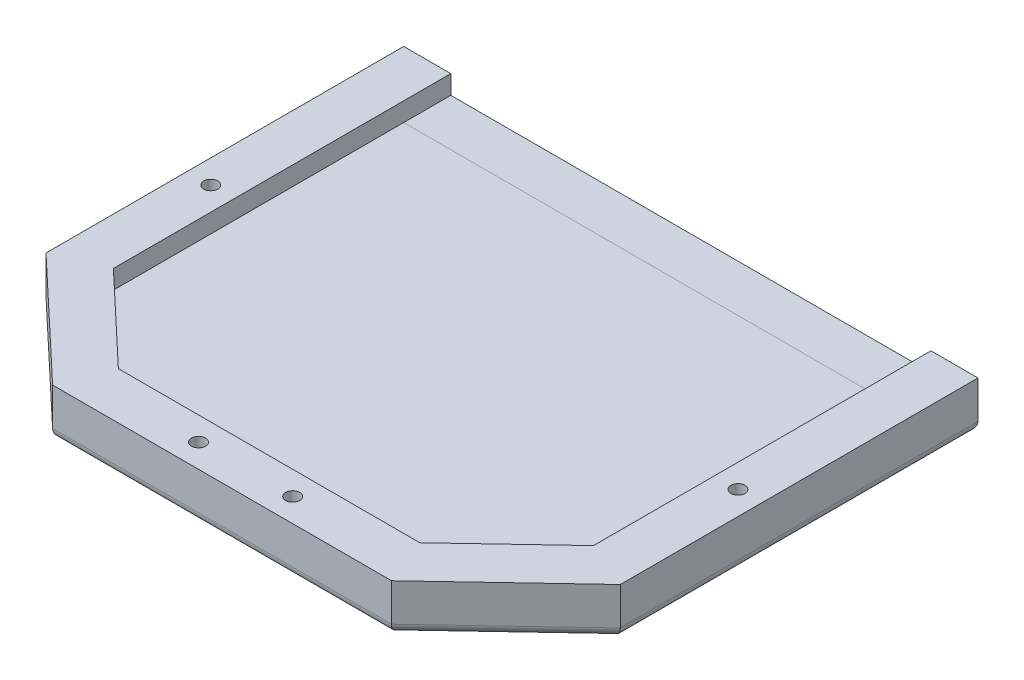
ISO-10303-21;
HEADER;
FILE_DESCRIPTION(('STEP AP214'),'2;1');
FILE_NAME('part.step','',(''),(''),'','','');
FILE_SCHEMA(('AUTOMOTIVE_DESIGN { 1 0 10303 214 1 1 1 1 }'));
ENDSEC;
DATA;
#1=APPLICATION_CONTEXT('core data for automotive mechanical design processes');
#2=APPLICATION_PROTOCOL_DEFINITION('international standard','automotive_design',2000,#1);
#3=PRODUCT_CONTEXT('',#1,'mechanical');
#4=PRODUCT('Part','Part','',(#3));
#5=PRODUCT_RELATED_PRODUCT_CATEGORY('part','',(#4));
#6=PRODUCT_DEFINITION_FORMATION('','',#4);
#7=PRODUCT_DEFINITION_CONTEXT('part definition',#1,'design');
#8=PRODUCT_DEFINITION('design','',#6,#7);
#9=PRODUCT_DEFINITION_SHAPE('','',#8);
#10=(LENGTH_UNIT() NAMED_UNIT(*) SI_UNIT(.MILLI.,.METRE.));
#11=(NAMED_UNIT(*) PLANE_ANGLE_UNIT() SI_UNIT($,.RADIAN.));
#12=(NAMED_UNIT(*) SI_UNIT($,.STERADIAN.) SOLID_ANGLE_UNIT());
#13=UNCERTAINTY_MEASURE_WITH_UNIT(LENGTH_MEASURE(1.E-05),#10,'distance_accuracy_value','');
#14=(GEOMETRIC_REPRESENTATION_CONTEXT(3) GLOBAL_UNCERTAINTY_ASSIGNED_CONTEXT((#13)) GLOBAL_UNIT_ASSIGNED_CONTEXT((#10,
#11,#12)) REPRESENTATION_CONTEXT('',''));
#15=CARTESIAN_POINT('',(0.,0.,0.));
#16=DIRECTION('',(0.,0.,1.));
#17=DIRECTION('',(1.,0.,0.));
#18=AXIS2_PLACEMENT_3D('',#15,#16,#17);
#19=CARTESIAN_POINT('',(-24.7421052631579,3.,43.1447368421053));
#20=DIRECTION('',(1.,0.,0.));
#21=DIRECTION('',(0.,0.,-1.));
#22=AXIS2_PLACEMENT_3D('',#19,#20,#21);
#23=PLANE('',#22);
#24=DIRECTION('',(0.,-1.,0.));
#25=VECTOR('',#24,1.);
#26=CARTESIAN_POINT('',(-24.7421052631579,3.,43.1447368421053));
#27=LINE('',#26,#25);
#28=CARTESIAN_POINT('',(-24.7421052631579,5.,43.1447368421053));
#29=VERTEX_POINT('',#28);
#30=CARTESIAN_POINT('',(-24.7421052631579,1.,43.1447368421053));
#31=VERTEX_POINT('',#30);
#32=EDGE_CURVE('E352',#29,#31,#27,.T.);
#33=ORIENTED_EDGE('',*,*,#32,.T.);
#34=DIRECTION('',(0.,0.,1.));
#35=VECTOR('',#34,1.);
#36=CARTESIAN_POINT('',(-24.7421052631579,1.,81.1447368421053));
#37=LINE('',#36,#35);
#38=CARTESIAN_POINT('',(-24.7421052631579,1.,81.1447368421053));
#39=VERTEX_POINT('',#38);
#40=EDGE_CURVE('E457',#31,#39,#37,.T.);
#41=ORIENTED_EDGE('',*,*,#40,.T.);
#42=DIRECTION('',(0.,-1.,0.));
#43=VECTOR('',#42,1.);
#44=CARTESIAN_POINT('',(-24.7421052631579,3.,81.1447368421053));
#45=LINE('',#44,#43);
#46=CARTESIAN_POINT('',(-24.7421052631579,5.,81.1447368421053));
#47=VERTEX_POINT('',#46);
#48=EDGE_CURVE('E369',#47,#39,#45,.T.);
#49=ORIENTED_EDGE('',*,*,#48,.F.);
#50=DIRECTION('',(0.,0.,1.));
#51=VECTOR('',#50,1.);
#52=CARTESIAN_POINT('',(-24.7421052631579,5.,48.1447368421053));
#53=LINE('',#52,#51);
#54=EDGE_CURVE('E328',#29,#47,#53,.T.);
#55=ORIENTED_EDGE('',*,*,#54,.F.);
#56=EDGE_LOOP('',(#33,#41,#49,#55));
#57=FACE_BOUND('',#56,.T.);
#58=ADVANCED_FACE('F74',(#57),#23,.F.);
#59=CARTESIAN_POINT('',(-24.7421052631579,3.,81.1447368421053));
#60=DIRECTION('',(0.686452693255578,0.,-0.727174463194468));
#61=DIRECTION('',(-0.727174463194468,0.,-0.686452693255578));
#62=AXIS2_PLACEMENT_3D('',#59,#60,#61);
#63=PLANE('',#62);
#64=ORIENTED_EDGE('',*,*,#48,.T.);
#65=DIRECTION('',(0.727174463194468,0.,0.686452693255578));
#66=VECTOR('',#65,1.);
#67=CARTESIAN_POINT('',(-12.2421052631579,1.,92.9447368421053));
#68=LINE('',#67,#66);
#69=CARTESIAN_POINT('',(-12.2421052631579,1.,92.9447368421053));
#70=VERTEX_POINT('',#69);
#71=EDGE_CURVE('E373',#39,#70,#68,.T.);
#72=ORIENTED_EDGE('',*,*,#71,.T.);
#73=DIRECTION('',(0.,-1.,0.));
#74=VECTOR('',#73,1.);
#75=CARTESIAN_POINT('',(-12.2421052631579,3.,92.9447368421053));
#76=LINE('',#75,#74);
#77=CARTESIAN_POINT('',(-12.2421052631579,5.,92.9447368421053));
#78=VERTEX_POINT('',#77);
#79=EDGE_CURVE('E365',#78,#70,#76,.T.);
#80=ORIENTED_EDGE('',*,*,#79,.F.);
#81=DIRECTION('',(0.727174463194468,0.,0.686452693255579));
#82=VECTOR('',#81,1.);
#83=CARTESIAN_POINT('',(-23.1743687294358,5.,82.6246801299389));
#84=LINE('',#83,#82);
#85=EDGE_CURVE('E332',#47,#78,#84,.T.);
#86=ORIENTED_EDGE('',*,*,#85,.F.);
#87=EDGE_LOOP('',(#64,#72,#80,#86));
#88=FACE_BOUND('',#87,.T.);
#89=ADVANCED_FACE('F618',(#88),#63,.F.);
#90=CARTESIAN_POINT('',(23.7578947368421,3.,92.9447368421053));
#91=DIRECTION('',(0.,0.,-1.));
#92=DIRECTION('',(-1.,0.,0.));
#93=AXIS2_PLACEMENT_3D('',#90,#91,#92);
#94=PLANE('',#93);
#95=ORIENTED_EDGE('',*,*,#79,.T.);
#96=DIRECTION('',(1.,0.,0.));
#97=VECTOR('',#96,1.);
#98=CARTESIAN_POINT('',(23.7578947368421,1.,92.9447368421053));
#99=LINE('',#98,#97);
#100=CARTESIAN_POINT('',(23.7578947368421,1.,92.9447368421053));
#101=VERTEX_POINT('',#100);
#102=EDGE_CURVE('E447',#70,#101,#99,.T.);
#103=ORIENTED_EDGE('',*,*,#102,.T.);
#104=DIRECTION('',(0.,-1.,0.));
#105=VECTOR('',#104,1.);
#106=CARTESIAN_POINT('',(23.7578947368421,3.,92.9447368421053));
#107=LINE('',#106,#105);
#108=CARTESIAN_POINT('',(23.7578947368421,5.,92.9447368421053));
#109=VERTEX_POINT('',#108);
#110=EDGE_CURVE('E361',#109,#101,#107,.T.);
#111=ORIENTED_EDGE('',*,*,#110,.F.);
#112=DIRECTION('',(1.,0.,0.));
#113=VECTOR('',#112,1.);
#114=CARTESIAN_POINT('',(-10.2548923096212,5.,92.9447368421053));
#115=LINE('',#114,#113);
#116=EDGE_CURVE('E336',#78,#109,#115,.T.);
#117=ORIENTED_EDGE('',*,*,#116,.F.);
#118=EDGE_LOOP('',(#95,#103,#111,#117));
#119=FACE_BOUND('',#118,.T.);
#120=ADVANCED_FACE('F621',(#119),#94,.F.);
#121=CARTESIAN_POINT('',(36.2578947368421,3.,81.1447368421053));
#122=DIRECTION('',(-0.686452693255578,0.,-0.727174463194468));
#123=DIRECTION('',(-0.727174463194468,0.,0.686452693255578));
#124=AXIS2_PLACEMENT_3D('',#121,#122,#123);
#125=PLANE('',#124);
#126=ORIENTED_EDGE('',*,*,#110,.T.);
#127=DIRECTION('',(0.727174463194468,0.,-0.686452693255578));
#128=VECTOR('',#127,1.);
#129=CARTESIAN_POINT('',(36.2578947368421,1.,81.1447368421053));
#130=LINE('',#129,#128);
#131=CARTESIAN_POINT('',(36.2578947368421,1.,81.1447368421053));
#132=VERTEX_POINT('',#131);
#133=EDGE_CURVE('E450',#101,#132,#130,.T.);
#134=ORIENTED_EDGE('',*,*,#133,.T.);
#135=DIRECTION('',(0.,-1.,0.));
#136=VECTOR('',#135,1.);
#137=CARTESIAN_POINT('',(36.2578947368421,3.,81.1447368421053));
#138=LINE('',#137,#136);
#139=CARTESIAN_POINT('',(36.2578947368421,5.,81.1447368421053));
#140=VERTEX_POINT('',#139);
#141=EDGE_CURVE('E358',#140,#132,#138,.T.);
#142=ORIENTED_EDGE('',*,*,#141,.F.);
#143=DIRECTION('',(0.727174463194468,0.,-0.686452693255578));
#144=VECTOR('',#143,1.);
#145=CARTESIAN_POINT('',(34.69015820312,5.,82.6246801299389));
#146=LINE('',#145,#144);
#147=EDGE_CURVE('E340',#109,#140,#146,.T.);
#148=ORIENTED_EDGE('',*,*,#147,.F.);
#149=EDGE_LOOP('',(#126,#134,#142,#148));
#150=FACE_BOUND('',#149,.T.);
#151=ADVANCED_FACE('F573',(#150),#125,.F.);
#152=CARTESIAN_POINT('',(36.2578947368421,3.,43.1447368421053));
#153=DIRECTION('',(-1.,0.,0.));
#154=DIRECTION('',(0.,0.,1.));
#155=AXIS2_PLACEMENT_3D('',#152,#153,#154);
#156=PLANE('',#155);
#157=ORIENTED_EDGE('',*,*,#141,.T.);
#158=DIRECTION('',(0.,0.,-1.));
#159=VECTOR('',#158,1.);
#160=CARTESIAN_POINT('',(36.2578947368421,1.,43.1447368421053));
#161=LINE('',#160,#159);
#162=CARTESIAN_POINT('',(36.2578947368421,1.,43.1447368421053));
#163=VERTEX_POINT('',#162);
#164=EDGE_CURVE('E105',#132,#163,#161,.T.);
#165=ORIENTED_EDGE('',*,*,#164,.T.);
#166=DIRECTION('',(0.,-1.,0.));
#167=VECTOR('',#166,1.);
#168=CARTESIAN_POINT('',(36.2578947368421,3.,43.1447368421053));
#169=LINE('',#168,#167);
#170=CARTESIAN_POINT('',(36.2578947368421,5.,43.1447368421053));
#171=VERTEX_POINT('',#170);
#172=EDGE_CURVE('E355',#171,#163,#169,.T.);
#173=ORIENTED_EDGE('',*,*,#172,.F.);
#174=DIRECTION('',(0.,0.,-1.));
#175=VECTOR('',#174,1.);
#176=CARTESIAN_POINT('',(36.2578947368421,5.,48.1447368421053));
#177=LINE('',#176,#175);
#178=EDGE_CURVE('E344',#140,#171,#177,.T.);
#179=ORIENTED_EDGE('',*,*,#178,.F.);
#180=EDGE_LOOP('',(#157,#165,#173,#179));
#181=FACE_BOUND('',#180,.T.);
#182=ADVANCED_FACE('F576',(#181),#156,.F.);
#183=CARTESIAN_POINT('',(-24.7421052631579,3.,43.1447368421053));
#184=DIRECTION('',(0.,0.,1.));
#185=DIRECTION('',(1.,0.,0.));
#186=AXIS2_PLACEMENT_3D('',#183,#184,#185);
#187=PLANE('',#186);
#188=DIRECTION('',(-1.,0.,0.));
#189=VECTOR('',#188,1.);
#190=CARTESIAN_POINT('',(-19.7421052631579,5.,43.1447368421053));
#191=LINE('',#190,#189);
#192=CARTESIAN_POINT('',(-19.7421052631579,5.,43.1447368421053));
#193=VERTEX_POINT('',#192);
#194=EDGE_CURVE('E263',#193,#29,#191,.T.);
#195=ORIENTED_EDGE('',*,*,#194,.F.);
#196=DIRECTION('',(0.,-1.,0.));
#197=VECTOR('',#196,1.);
#198=CARTESIAN_POINT('',(-19.7421052631579,5.,43.1447368421053));
#199=LINE('',#198,#197);
#200=CARTESIAN_POINT('',(-19.7421052631579,2.9999,43.1447368421053));
#201=VERTEX_POINT('',#200);
#202=EDGE_CURVE('E244',#193,#201,#199,.T.);
#203=ORIENTED_EDGE('',*,*,#202,.T.);
#204=DIRECTION('',(1.,0.,0.));
#205=VECTOR('',#204,1.);
#206=CARTESIAN_POINT('',(0.,2.9999,43.1447368421053));
#207=LINE('',#206,#205);
#208=CARTESIAN_POINT('',(31.2578947368421,2.9999,43.1447368421053));
#209=VERTEX_POINT('',#208);
#210=EDGE_CURVE('E252',#201,#209,#207,.T.);
#211=ORIENTED_EDGE('',*,*,#210,.T.);
#212=DIRECTION('',(0.,-1.,0.));
#213=VECTOR('',#212,1.);
#214=CARTESIAN_POINT('',(31.2578947368421,5.,43.1447368421053));
#215=LINE('',#214,#213);
#216=CARTESIAN_POINT('',(31.2578947368421,5.,43.1447368421053));
#217=VERTEX_POINT('',#216);
#218=EDGE_CURVE('E582',#217,#209,#215,.T.);
#219=ORIENTED_EDGE('',*,*,#218,.F.);
#220=EDGE_CURVE('E348',#171,#217,#191,.T.);
#221=ORIENTED_EDGE('',*,*,#220,.F.);
#222=ORIENTED_EDGE('',*,*,#172,.T.);
#223=DIRECTION('',(-1.,0.,0.));
#224=VECTOR('',#223,1.);
#225=CARTESIAN_POINT('',(-24.7421052631579,1.,43.1447368421053));
#226=LINE('',#225,#224);
#227=EDGE_CURVE('E97',#163,#31,#226,.T.);
#228=ORIENTED_EDGE('',*,*,#227,.T.);
#229=ORIENTED_EDGE('',*,*,#32,.F.);
#230=EDGE_LOOP('',(#195,#203,#211,#219,#221,#222,#228,#229));
#231=FACE_BOUND('',#230,.T.);
#232=ADVANCED_FACE('F262',(#231),#187,.F.);
#233=CARTESIAN_POINT('',(0.,0.,0.));
#234=DIRECTION('',(0.,-1.,0.));
#235=DIRECTION('',(0.,0.,-1.));
#236=AXIS2_PLACEMENT_3D('',#233,#234,#235);
#237=PLANE('',#236);
#238=CARTESIAN_POINT('',(0.757894736842105,0.,90.4447368421053));
#239=DIRECTION('',(0.,-1.,0.));
#240=DIRECTION('',(0.,0.,-1.));
#241=AXIS2_PLACEMENT_3D('',#238,#239,#240);
#242=CIRCLE('',#241,1.75);
#243=CARTESIAN_POINT('',(0.757894736842105,0.,88.6947368421053));
#244=VERTEX_POINT('',#243);
#245=CARTESIAN_POINT('',(-0.143493082023891,0.,91.9447368421053));
#246=VERTEX_POINT('',#245);
#247=EDGE_CURVE('E441',#244,#246,#242,.F.);
#248=ORIENTED_EDGE('',*,*,#247,.T.);
#249=DIRECTION('',(1.,0.,0.));
#250=VECTOR('',#249,1.);
#251=CARTESIAN_POINT('',(-12.2421052631579,0.,91.9447368421053));
#252=LINE('',#251,#250);
#253=CARTESIAN_POINT('',(-11.8446626724506,0.,91.9447368421053));
#254=VERTEX_POINT('',#253);
#255=EDGE_CURVE('E444',#246,#254,#252,.F.);
#256=ORIENTED_EDGE('',*,*,#255,.T.);
#257=DIRECTION('',(0.727174463194468,0.,0.686452693255578));
#258=VECTOR('',#257,1.);
#259=CARTESIAN_POINT('',(-24.0556525699023,0.,80.4175623789108));
#260=LINE('',#259,#258);
#261=CARTESIAN_POINT('',(-23.7421052631579,0.,80.7135510364775));
#262=VERTEX_POINT('',#261);
#263=EDGE_CURVE('E437',#254,#262,#260,.F.);
#264=ORIENTED_EDGE('',*,*,#263,.T.);
#265=DIRECTION('',(0.,0.,1.));
#266=VECTOR('',#265,1.);
#267=CARTESIAN_POINT('',(-23.7421052631579,0.,43.1447368421053));
#268=LINE('',#267,#266);
#269=CARTESIAN_POINT('',(-23.7421052631579,0.,67.0461246609713));
#270=VERTEX_POINT('',#269);
#271=EDGE_CURVE('E434',#262,#270,#268,.F.);
#272=ORIENTED_EDGE('',*,*,#271,.T.);
#273=CARTESIAN_POINT('',(-22.2421052631579,0.,66.1447368421053));
#274=DIRECTION('',(0.,-1.,0.));
#275=DIRECTION('',(0.,0.,-1.));
#276=AXIS2_PLACEMENT_3D('',#273,#274,#275);
#277=CIRCLE('',#276,1.75);
#278=CARTESIAN_POINT('',(-22.2421052631579,0.,64.3947368421053));
#279=VERTEX_POINT('',#278);
#280=EDGE_CURVE('E428',#270,#279,#277,.F.);
#281=ORIENTED_EDGE('',*,*,#280,.T.);
#282=CARTESIAN_POINT('',(-22.2421052631579,0.,66.1447368421053));
#283=DIRECTION('',(0.,-1.,0.));
#284=DIRECTION('',(0.,0.,-1.));
#285=AXIS2_PLACEMENT_3D('',#282,#283,#284);
#286=CIRCLE('',#285,1.75);
#287=CARTESIAN_POINT('',(-23.7421052631579,0.,65.2433490232392));
#288=VERTEX_POINT('',#287);
#289=EDGE_CURVE('E425',#279,#288,#286,.F.);
#290=ORIENTED_EDGE('',*,*,#289,.T.);
#291=DIRECTION('',(0.,0.,1.));
#292=VECTOR('',#291,1.);
#293=CARTESIAN_POINT('',(-23.7421052631579,0.,43.1447368421053));
#294=LINE('',#293,#292);
#295=CARTESIAN_POINT('',(-23.7421052631579,0.,44.1447368421053));
#296=VERTEX_POINT('',#295);
#297=EDGE_CURVE('E419',#288,#296,#294,.F.);
#298=ORIENTED_EDGE('',*,*,#297,.T.);
#299=DIRECTION('',(-1.,0.,0.));
#300=VECTOR('',#299,1.);
#301=CARTESIAN_POINT('',(36.2578947368421,0.,44.1447368421053));
#302=LINE('',#301,#300);
#303=CARTESIAN_POINT('',(35.2578947368421,0.,44.1447368421053));
#304=VERTEX_POINT('',#303);
#305=EDGE_CURVE('E413',#296,#304,#302,.F.);
#306=ORIENTED_EDGE('',*,*,#305,.T.);
#307=DIRECTION('',(0.,0.,-1.));
#308=VECTOR('',#307,1.);
#309=CARTESIAN_POINT('',(35.2578947368421,0.,81.1447368421053));
#310=LINE('',#309,#308);
#311=CARTESIAN_POINT('',(35.2578947368421,0.,65.2433490232393));
#312=VERTEX_POINT('',#311);
#313=EDGE_CURVE('E401',#304,#312,#310,.F.);
#314=ORIENTED_EDGE('',*,*,#313,.T.);
#315=CARTESIAN_POINT('',(33.7578947368421,0.,66.1447368421053));
#316=DIRECTION('',(0.,-1.,0.));
#317=DIRECTION('',(0.,0.,-1.));
#318=AXIS2_PLACEMENT_3D('',#315,#316,#317);
#319=CIRCLE('',#318,1.75);
#320=CARTESIAN_POINT('',(33.7578947368421,0.,64.3947368421053));
#321=VERTEX_POINT('',#320);
#322=EDGE_CURVE('E395',#312,#321,#319,.F.);
#323=ORIENTED_EDGE('',*,*,#322,.T.);
#324=CARTESIAN_POINT('',(33.7578947368421,0.,66.1447368421053));
#325=DIRECTION('',(0.,-1.,0.));
#326=DIRECTION('',(0.,0.,-1.));
#327=AXIS2_PLACEMENT_3D('',#324,#325,#326);
#328=CIRCLE('',#327,1.75);
#329=CARTESIAN_POINT('',(35.2578947368421,0.,67.0461246609713));
#330=VERTEX_POINT('',#329);
#331=EDGE_CURVE('E392',#321,#330,#328,.F.);
#332=ORIENTED_EDGE('',*,*,#331,.T.);
#333=DIRECTION('',(0.,0.,-1.));
#334=VECTOR('',#333,1.);
#335=CARTESIAN_POINT('',(35.2578947368421,0.,81.1447368421053));
#336=LINE('',#335,#334);
#337=CARTESIAN_POINT('',(35.2578947368421,0.,80.7135510364775));
#338=VERTEX_POINT('',#337);
#339=EDGE_CURVE('E398',#330,#338,#336,.F.);
#340=ORIENTED_EDGE('',*,*,#339,.T.);
#341=DIRECTION('',(0.727174463194468,0.,-0.686452693255578));
#342=VECTOR('',#341,1.);
#343=CARTESIAN_POINT('',(23.0714420435865,0.,92.2175623789108));
#344=LINE('',#343,#342);
#345=CARTESIAN_POINT('',(23.3604521461348,0.,91.9447368421053));
#346=VERTEX_POINT('',#345);
#347=EDGE_CURVE('E404',#338,#346,#344,.F.);
#348=ORIENTED_EDGE('',*,*,#347,.T.);
#349=DIRECTION('',(1.,0.,0.));
#350=VECTOR('',#349,1.);
#351=CARTESIAN_POINT('',(-12.2421052631579,0.,91.9447368421053));
#352=LINE('',#351,#350);
#353=CARTESIAN_POINT('',(11.6592825557081,0.,91.9447368421053));
#354=VERTEX_POINT('',#353);
#355=EDGE_CURVE('E407',#346,#354,#352,.F.);
#356=ORIENTED_EDGE('',*,*,#355,.T.);
#357=CARTESIAN_POINT('',(10.7578947368421,0.,90.4447368421053));
#358=DIRECTION('',(0.,-1.,0.));
#359=DIRECTION('',(0.,0.,-1.));
#360=AXIS2_PLACEMENT_3D('',#357,#358,#359);
#361=CIRCLE('',#360,1.75);
#362=CARTESIAN_POINT('',(10.7578947368421,0.,88.6947368421053));
#363=VERTEX_POINT('',#362);
#364=EDGE_CURVE('E410',#354,#363,#361,.F.);
#365=ORIENTED_EDGE('',*,*,#364,.T.);
#366=CARTESIAN_POINT('',(10.7578947368421,0.,90.4447368421053));
#367=DIRECTION('',(0.,-1.,0.));
#368=DIRECTION('',(0.,0.,-1.));
#369=AXIS2_PLACEMENT_3D('',#366,#367,#368);
#370=CIRCLE('',#369,1.75);
#371=CARTESIAN_POINT('',(9.85650691797611,0.,91.9447368421053));
#372=VERTEX_POINT('',#371);
#373=EDGE_CURVE('E416',#363,#372,#370,.F.);
#374=ORIENTED_EDGE('',*,*,#373,.T.);
#375=DIRECTION('',(1.,0.,0.));
#376=VECTOR('',#375,1.);
#377=CARTESIAN_POINT('',(-12.2421052631579,0.,91.9447368421053));
#378=LINE('',#377,#376);
#379=CARTESIAN_POINT('',(1.6592825557081,0.,91.9447368421053));
#380=VERTEX_POINT('',#379);
#381=EDGE_CURVE('E422',#372,#380,#378,.F.);
#382=ORIENTED_EDGE('',*,*,#381,.T.);
#383=CARTESIAN_POINT('',(0.757894736842105,0.,90.4447368421053));
#384=DIRECTION('',(0.,-1.,0.));
#385=DIRECTION('',(0.,0.,-1.));
#386=AXIS2_PLACEMENT_3D('',#383,#384,#385);
#387=CIRCLE('',#386,1.75);
#388=EDGE_CURVE('E431',#380,#244,#387,.F.);
#389=ORIENTED_EDGE('',*,*,#388,.T.);
#390=EDGE_LOOP('',(#248,#256,#264,#272,#281,#290,#298,#306,#314,#323,#332,#340,#348,#356,#365,
#374,#382,#389));
#391=FACE_BOUND('',#390,.T.);
#392=ADVANCED_FACE('F547',(#391),#237,.T.);
#393=CARTESIAN_POINT('',(0.,5.,0.));
#394=DIRECTION('',(0.,1.,0.));
#395=DIRECTION('',(0.,0.,1.));
#396=AXIS2_PLACEMENT_3D('',#393,#394,#395);
#397=PLANE('',#396);
#398=DIRECTION('',(0.,0.,1.));
#399=VECTOR('',#398,1.);
#400=CARTESIAN_POINT('',(-19.7421052631579,5.,48.1447368421053));
#401=LINE('',#400,#399);
#402=CARTESIAN_POINT('',(-19.7421052631579,5.,78.9888078139666));
#403=VERTEX_POINT('',#402);
#404=EDGE_CURVE('E275',#193,#403,#401,.T.);
#405=ORIENTED_EDGE('',*,*,#404,.F.);
#406=ORIENTED_EDGE('',*,*,#194,.T.);
#407=ORIENTED_EDGE('',*,*,#54,.T.);
#408=ORIENTED_EDGE('',*,*,#85,.T.);
#409=ORIENTED_EDGE('',*,*,#116,.T.);
#410=ORIENTED_EDGE('',*,*,#147,.T.);
#411=ORIENTED_EDGE('',*,*,#178,.T.);
#412=ORIENTED_EDGE('',*,*,#220,.T.);
#413=DIRECTION('',(0.,0.,-1.));
#414=VECTOR('',#413,1.);
#415=CARTESIAN_POINT('',(31.2578947368421,5.,48.1447368421053));
#416=LINE('',#415,#414);
#417=CARTESIAN_POINT('',(31.2578947368421,5.,78.9888078139666));
#418=VERTEX_POINT('',#417);
#419=EDGE_CURVE('E288',#418,#217,#416,.T.);
#420=ORIENTED_EDGE('',*,*,#419,.F.);
#421=DIRECTION('',(0.727174463194468,0.,-0.686452693255578));
#422=VECTOR('',#421,1.);
#423=CARTESIAN_POINT('',(31.2578947368421,5.,78.9888078139666));
#424=LINE('',#423,#422);
#425=CARTESIAN_POINT('',(21.7706817833054,5.,87.9447368421053));
#426=VERTEX_POINT('',#425);
#427=EDGE_CURVE('E285',#426,#418,#424,.T.);
#428=ORIENTED_EDGE('',*,*,#427,.F.);
#429=DIRECTION('',(1.,0.,0.));
#430=VECTOR('',#429,1.);
#431=CARTESIAN_POINT('',(-10.2548923096212,5.,87.9447368421053));
#432=LINE('',#431,#430);
#433=CARTESIAN_POINT('',(-10.2548923096212,5.,87.9447368421053));
#434=VERTEX_POINT('',#433);
#435=EDGE_CURVE('E282',#434,#426,#432,.T.);
#436=ORIENTED_EDGE('',*,*,#435,.F.);
#437=DIRECTION('',(0.727174463194468,0.,0.686452693255578));
#438=VECTOR('',#437,1.);
#439=CARTESIAN_POINT('',(-19.7421052631579,5.,78.9888078139666));
#440=LINE('',#439,#438);
#441=EDGE_CURVE('E278',#403,#434,#440,.T.);
#442=ORIENTED_EDGE('',*,*,#441,.F.);
#443=EDGE_LOOP('',(#405,#406,#407,#408,#409,#410,#411,#412,#420,#428,#436,#442));
#444=FACE_BOUND('',#443,.T.);
#445=CARTESIAN_POINT('',(33.7578947368421,5.,66.1447368421053));
#446=DIRECTION('',(0.,1.,0.));
#447=DIRECTION('',(0.,0.,1.));
#448=AXIS2_PLACEMENT_3D('',#445,#446,#447);
#449=CIRCLE('',#448,0.749999999999999);
#450=CARTESIAN_POINT('',(33.7578947368421,5.,66.8947368421053));
#451=VERTEX_POINT('',#450);
#452=EDGE_CURVE('E297',#451,#451,#449,.F.);
#453=ORIENTED_EDGE('',*,*,#452,.T.);
#454=EDGE_LOOP('',(#453));
#455=FACE_BOUND('',#454,.T.);
#456=CARTESIAN_POINT('',(-22.2421052631579,5.,66.1447368421053));
#457=DIRECTION('',(0.,1.,0.));
#458=DIRECTION('',(0.,0.,1.));
#459=AXIS2_PLACEMENT_3D('',#456,#457,#458);
#460=CIRCLE('',#459,0.750000000000002);
#461=CARTESIAN_POINT('',(-22.2421052631579,5.,66.8947368421053));
#462=VERTEX_POINT('',#461);
#463=EDGE_CURVE('E382',#462,#462,#460,.F.);
#464=ORIENTED_EDGE('',*,*,#463,.T.);
#465=EDGE_LOOP('',(#464));
#466=FACE_BOUND('',#465,.T.);
#467=CARTESIAN_POINT('',(10.7578947368421,5.,90.4447368421053));
#468=DIRECTION('',(0.,1.,0.));
#469=DIRECTION('',(0.,0.,1.));
#470=AXIS2_PLACEMENT_3D('',#467,#468,#469);
#471=CIRCLE('',#470,0.75);
#472=CARTESIAN_POINT('',(10.7578947368421,5.,91.1947368421053));
#473=VERTEX_POINT('',#472);
#474=EDGE_CURVE('E378',#473,#473,#471,.F.);
#475=ORIENTED_EDGE('',*,*,#474,.T.);
#476=EDGE_LOOP('',(#475));
#477=FACE_BOUND('',#476,.T.);
#478=CARTESIAN_POINT('',(0.757894736842105,5.,90.4447368421053));
#479=DIRECTION('',(0.,1.,0.));
#480=DIRECTION('',(0.,0.,1.));
#481=AXIS2_PLACEMENT_3D('',#478,#479,#480);
#482=CIRCLE('',#481,0.75);
#483=CARTESIAN_POINT('',(0.757894736842105,5.,91.1947368421053));
#484=VERTEX_POINT('',#483);
#485=EDGE_CURVE('E374',#484,#484,#482,.F.);
#486=ORIENTED_EDGE('',*,*,#485,.T.);
#487=EDGE_LOOP('',(#486));
#488=FACE_BOUND('',#487,.T.);
#489=ADVANCED_FACE('F579',(#444,#455,#466,#477,#488),#397,.T.);
#490=CARTESIAN_POINT('',(-19.7421052631579,5.,48.1447368421053));
#491=DIRECTION('',(1.,0.,0.));
#492=DIRECTION('',(0.,0.,-1.));
#493=AXIS2_PLACEMENT_3D('',#490,#491,#492);
#494=PLANE('',#493);
#495=DIRECTION('',(0.,0.,1.));
#496=VECTOR('',#495,1.);
#497=CARTESIAN_POINT('',(-19.7421052631579,3.,48.1447368421053));
#498=LINE('',#497,#496);
#499=CARTESIAN_POINT('',(-19.7421052631579,3.,48.1447368421053));
#500=VERTEX_POINT('',#499);
#501=CARTESIAN_POINT('',(-19.7421052631579,3.,78.9888078139666));
#502=VERTEX_POINT('',#501);
#503=EDGE_CURVE('E292',#500,#502,#498,.T.);
#504=ORIENTED_EDGE('',*,*,#503,.F.);
#505=DIRECTION('',(0.,-1.,0.));
#506=VECTOR('',#505,1.);
#507=CARTESIAN_POINT('',(-19.7421052631579,5.,48.1447368421053));
#508=LINE('',#507,#506);
#509=CARTESIAN_POINT('',(-19.7421052631579,2.9999,48.1447368421053));
#510=VERTEX_POINT('',#509);
#511=EDGE_CURVE('E246',#500,#510,#508,.T.);
#512=ORIENTED_EDGE('',*,*,#511,.T.);
#513=DIRECTION('',(0.,0.,-1.));
#514=VECTOR('',#513,1.);
#515=CARTESIAN_POINT('',(-19.7421052631578,2.9999,0.));
#516=LINE('',#515,#514);
#517=EDGE_CURVE('E239',#510,#201,#516,.T.);
#518=ORIENTED_EDGE('',*,*,#517,.T.);
#519=ORIENTED_EDGE('',*,*,#202,.F.);
#520=ORIENTED_EDGE('',*,*,#404,.T.);
#521=DIRECTION('',(0.,-1.,0.));
#522=VECTOR('',#521,1.);
#523=CARTESIAN_POINT('',(-19.7421052631579,5.,78.9888078139666));
#524=LINE('',#523,#522);
#525=EDGE_CURVE('E324',#403,#502,#524,.T.);
#526=ORIENTED_EDGE('',*,*,#525,.T.);
#527=EDGE_LOOP('',(#504,#512,#518,#519,#520,#526));
#528=FACE_BOUND('',#527,.T.);
#529=ADVANCED_FACE('F242',(#528),#494,.T.);
#530=CARTESIAN_POINT('',(-19.7421052631579,5.,78.9888078139666));
#531=DIRECTION('',(0.686452693255579,0.,-0.727174463194468));
#532=DIRECTION('',(-0.727174463194468,0.,-0.686452693255579));
#533=AXIS2_PLACEMENT_3D('',#530,#531,#532);
#534=PLANE('',#533);
#535=DIRECTION('',(0.727174463194468,0.,0.686452693255578));
#536=VECTOR('',#535,1.);
#537=CARTESIAN_POINT('',(-19.7421052631579,3.,78.9888078139666));
#538=LINE('',#537,#536);
#539=CARTESIAN_POINT('',(-10.2548923096212,3.,87.9447368421053));
#540=VERTEX_POINT('',#539);
#541=EDGE_CURVE('E296',#502,#540,#538,.T.);
#542=ORIENTED_EDGE('',*,*,#541,.F.);
#543=ORIENTED_EDGE('',*,*,#525,.F.);
#544=ORIENTED_EDGE('',*,*,#441,.T.);
#545=DIRECTION('',(0.,-1.,0.));
#546=VECTOR('',#545,1.);
#547=CARTESIAN_POINT('',(-10.2548923096212,5.,87.9447368421053));
#548=LINE('',#547,#546);
#549=EDGE_CURVE('E321',#434,#540,#548,.T.);
#550=ORIENTED_EDGE('',*,*,#549,.T.);
#551=EDGE_LOOP('',(#542,#543,#544,#550));
#552=FACE_BOUND('',#551,.T.);
#553=ADVANCED_FACE('F611',(#552),#534,.T.);
#554=CARTESIAN_POINT('',(-10.2548923096212,5.,87.9447368421053));
#555=DIRECTION('',(0.,0.,-1.));
#556=DIRECTION('',(-1.,0.,0.));
#557=AXIS2_PLACEMENT_3D('',#554,#555,#556);
#558=PLANE('',#557);
#559=DIRECTION('',(1.,0.,0.));
#560=VECTOR('',#559,1.);
#561=CARTESIAN_POINT('',(-10.2548923096212,3.,87.9447368421053));
#562=LINE('',#561,#560);
#563=CARTESIAN_POINT('',(21.7706817833054,3.,87.9447368421053));
#564=VERTEX_POINT('',#563);
#565=EDGE_CURVE('E301',#540,#564,#562,.T.);
#566=ORIENTED_EDGE('',*,*,#565,.F.);
#567=ORIENTED_EDGE('',*,*,#549,.F.);
#568=ORIENTED_EDGE('',*,*,#435,.T.);
#569=DIRECTION('',(0.,-1.,0.));
#570=VECTOR('',#569,1.);
#571=CARTESIAN_POINT('',(21.7706817833054,5.,87.9447368421053));
#572=LINE('',#571,#570);
#573=EDGE_CURVE('E318',#426,#564,#572,.T.);
#574=ORIENTED_EDGE('',*,*,#573,.T.);
#575=EDGE_LOOP('',(#566,#567,#568,#574));
#576=FACE_BOUND('',#575,.T.);
#577=ADVANCED_FACE('F609',(#576),#558,.T.);
#578=CARTESIAN_POINT('',(31.2578947368421,5.,78.9888078139666));
#579=DIRECTION('',(-0.686452693255578,0.,-0.727174463194468));
#580=DIRECTION('',(-0.727174463194468,0.,0.686452693255578));
#581=AXIS2_PLACEMENT_3D('',#578,#579,#580);
#582=PLANE('',#581);
#583=DIRECTION('',(0.727174463194468,0.,-0.686452693255578));
#584=VECTOR('',#583,1.);
#585=CARTESIAN_POINT('',(31.2578947368421,3.,78.9888078139666));
#586=LINE('',#585,#584);
#587=CARTESIAN_POINT('',(31.2578947368421,3.,78.9888078139666));
#588=VERTEX_POINT('',#587);
#589=EDGE_CURVE('E305',#564,#588,#586,.T.);
#590=ORIENTED_EDGE('',*,*,#589,.F.);
#591=ORIENTED_EDGE('',*,*,#573,.F.);
#592=ORIENTED_EDGE('',*,*,#427,.T.);
#593=DIRECTION('',(0.,-1.,0.));
#594=VECTOR('',#593,1.);
#595=CARTESIAN_POINT('',(31.2578947368421,5.,78.9888078139666));
#596=LINE('',#595,#594);
#597=EDGE_CURVE('E291',#418,#588,#596,.T.);
#598=ORIENTED_EDGE('',*,*,#597,.T.);
#599=EDGE_LOOP('',(#590,#591,#592,#598));
#600=FACE_BOUND('',#599,.T.);
#601=ADVANCED_FACE('F603',(#600),#582,.T.);
#602=CARTESIAN_POINT('',(31.2578947368421,5.,48.1447368421053));
#603=DIRECTION('',(-1.,0.,0.));
#604=DIRECTION('',(0.,0.,1.));
#605=AXIS2_PLACEMENT_3D('',#602,#603,#604);
#606=PLANE('',#605);
#607=DIRECTION('',(0.,0.,-1.));
#608=VECTOR('',#607,1.);
#609=CARTESIAN_POINT('',(31.2578947368421,3.,48.1447368421053));
#610=LINE('',#609,#608);
#611=CARTESIAN_POINT('',(31.2578947368421,3.,48.1447368421053));
#612=VERTEX_POINT('',#611);
#613=EDGE_CURVE('E309',#588,#612,#610,.T.);
#614=ORIENTED_EDGE('',*,*,#613,.F.);
#615=ORIENTED_EDGE('',*,*,#597,.F.);
#616=ORIENTED_EDGE('',*,*,#419,.T.);
#617=ORIENTED_EDGE('',*,*,#218,.T.);
#618=DIRECTION('',(0.,0.,-1.));
#619=VECTOR('',#618,1.);
#620=CARTESIAN_POINT('',(31.2578947368421,2.9999,0.));
#621=LINE('',#620,#619);
#622=CARTESIAN_POINT('',(31.2578947368421,2.9999,48.1447368421053));
#623=VERTEX_POINT('',#622);
#624=EDGE_CURVE('E258',#623,#209,#621,.T.);
#625=ORIENTED_EDGE('',*,*,#624,.F.);
#626=DIRECTION('',(0.,-1.,0.));
#627=VECTOR('',#626,1.);
#628=CARTESIAN_POINT('',(31.2578947368421,5.,48.1447368421053));
#629=LINE('',#628,#627);
#630=EDGE_CURVE('E271',#612,#623,#629,.T.);
#631=ORIENTED_EDGE('',*,*,#630,.F.);
#632=EDGE_LOOP('',(#614,#615,#616,#617,#625,#631));
#633=FACE_BOUND('',#632,.T.);
#634=ADVANCED_FACE('F595',(#633),#606,.T.);
#635=CARTESIAN_POINT('',(0.,3.,0.));
#636=DIRECTION('',(0.,-1.,0.));
#637=DIRECTION('',(0.,0.,-1.));
#638=AXIS2_PLACEMENT_3D('',#635,#636,#637);
#639=PLANE('',#638);
#640=DIRECTION('',(-1.,0.,0.));
#641=VECTOR('',#640,1.);
#642=CARTESIAN_POINT('',(-19.7421052631579,3.,48.1447368421053));
#643=LINE('',#642,#641);
#644=EDGE_CURVE('E279',#612,#500,#643,.T.);
#645=ORIENTED_EDGE('',*,*,#644,.T.);
#646=ORIENTED_EDGE('',*,*,#503,.T.);
#647=ORIENTED_EDGE('',*,*,#541,.T.);
#648=ORIENTED_EDGE('',*,*,#565,.T.);
#649=ORIENTED_EDGE('',*,*,#589,.T.);
#650=ORIENTED_EDGE('',*,*,#613,.T.);
#651=EDGE_LOOP('',(#645,#646,#647,#648,#649,#650));
#652=FACE_BOUND('',#651,.T.);
#653=ADVANCED_FACE('F598',(#652),#639,.F.);
#654=CARTESIAN_POINT('',(0.757894736842105,32.,90.4447368421053));
#655=DIRECTION('',(0.,-1.,0.));
#656=DIRECTION('',(0.,0.,-1.));
#657=AXIS2_PLACEMENT_3D('',#654,#655,#656);
#658=CYLINDRICAL_SURFACE('',#657,0.75);
#659=CARTESIAN_POINT('',(0.757894736842105,1.,90.4447368421053));
#660=DIRECTION('',(0.,-1.,0.));
#661=DIRECTION('',(0.,0.,-1.));
#662=AXIS2_PLACEMENT_3D('',#659,#660,#661);
#663=CIRCLE('',#662,0.75);
#664=CARTESIAN_POINT('',(0.757894736842105,1.,89.6947368421053));
#665=VERTEX_POINT('',#664);
#666=EDGE_CURVE('E460',#665,#665,#663,.T.);
#667=ORIENTED_EDGE('',*,*,#666,.T.);
#668=EDGE_LOOP('',(#667));
#669=FACE_BOUND('',#668,.T.);
#670=ORIENTED_EDGE('',*,*,#485,.F.);
#671=EDGE_LOOP('',(#670));
#672=FACE_BOUND('',#671,.T.);
#673=ADVANCED_FACE('F668',(#669,#672),#658,.F.);
#674=CARTESIAN_POINT('',(10.7578947368421,32.,90.4447368421053));
#675=DIRECTION('',(0.,-1.,0.));
#676=DIRECTION('',(0.,0.,-1.));
#677=AXIS2_PLACEMENT_3D('',#674,#675,#676);
#678=CYLINDRICAL_SURFACE('',#677,0.75);
#679=CARTESIAN_POINT('',(10.7578947368421,1.,90.4447368421053));
#680=DIRECTION('',(0.,-1.,0.));
#681=DIRECTION('',(0.,0.,-1.));
#682=AXIS2_PLACEMENT_3D('',#679,#680,#681);
#683=CIRCLE('',#682,0.75);
#684=CARTESIAN_POINT('',(10.7578947368421,1.,89.6947368421053));
#685=VERTEX_POINT('',#684);
#686=EDGE_CURVE('E464',#685,#685,#683,.T.);
#687=ORIENTED_EDGE('',*,*,#686,.T.);
#688=EDGE_LOOP('',(#687));
#689=FACE_BOUND('',#688,.T.);
#690=ORIENTED_EDGE('',*,*,#474,.F.);
#691=EDGE_LOOP('',(#690));
#692=FACE_BOUND('',#691,.T.);
#693=ADVANCED_FACE('F664',(#689,#692),#678,.F.);
#694=CARTESIAN_POINT('',(-22.2421052631579,32.,66.1447368421053));
#695=DIRECTION('',(0.,-1.,0.));
#696=DIRECTION('',(0.,0.,-1.));
#697=AXIS2_PLACEMENT_3D('',#694,#695,#696);
#698=CYLINDRICAL_SURFACE('',#697,0.750000000000002);
#699=CARTESIAN_POINT('',(-22.2421052631579,1.,66.1447368421053));
#700=DIRECTION('',(0.,-1.,0.));
#701=DIRECTION('',(0.,0.,-1.));
#702=AXIS2_PLACEMENT_3D('',#699,#700,#701);
#703=CIRCLE('',#702,0.750000000000002);
#704=CARTESIAN_POINT('',(-22.2421052631579,1.,65.3947368421053));
#705=VERTEX_POINT('',#704);
#706=EDGE_CURVE('E89',#705,#705,#703,.T.);
#707=ORIENTED_EDGE('',*,*,#706,.T.);
#708=EDGE_LOOP('',(#707));
#709=FACE_BOUND('',#708,.T.);
#710=ORIENTED_EDGE('',*,*,#463,.F.);
#711=EDGE_LOOP('',(#710));
#712=FACE_BOUND('',#711,.T.);
#713=ADVANCED_FACE('F667',(#709,#712),#698,.F.);
#714=CARTESIAN_POINT('',(33.7578947368421,32.,66.1447368421053));
#715=DIRECTION('',(0.,-1.,0.));
#716=DIRECTION('',(0.,0.,-1.));
#717=AXIS2_PLACEMENT_3D('',#714,#715,#716);
#718=CYLINDRICAL_SURFACE('',#717,0.749999999999999);
#719=CARTESIAN_POINT('',(33.7578947368421,1.,66.1447368421053));
#720=DIRECTION('',(0.,-1.,0.));
#721=DIRECTION('',(0.,0.,-1.));
#722=AXIS2_PLACEMENT_3D('',#719,#720,#721);
#723=CIRCLE('',#722,0.749999999999999);
#724=CARTESIAN_POINT('',(33.7578947368421,1.,65.3947368421053));
#725=VERTEX_POINT('',#724);
#726=EDGE_CURVE('E12',#725,#725,#723,.T.);
#727=ORIENTED_EDGE('',*,*,#726,.T.);
#728=EDGE_LOOP('',(#727));
#729=FACE_BOUND('',#728,.T.);
#730=ORIENTED_EDGE('',*,*,#452,.F.);
#731=EDGE_LOOP('',(#730));
#732=FACE_BOUND('',#731,.T.);
#733=ADVANCED_FACE('F672',(#729,#732),#718,.F.);
#734=CARTESIAN_POINT('',(33.7578947368421,1.,66.1447368421053));
#735=DIRECTION('',(0.,-1.,0.));
#736=DIRECTION('',(0.,0.,-1.));
#737=AXIS2_PLACEMENT_3D('',#734,#735,#736);
#738=TOROIDAL_SURFACE('',#737,1.75,1.);
#739=ORIENTED_EDGE('',*,*,#726,.F.);
#740=EDGE_LOOP('',(#739));
#741=FACE_BOUND('',#740,.T.);
#742=ORIENTED_EDGE('',*,*,#331,.F.);
#743=ORIENTED_EDGE('',*,*,#322,.F.);
#744=CARTESIAN_POINT('',(35.2578947368421,0.,67.0461246609713));
#745=CARTESIAN_POINT('',(35.2586798031644,1.34136745547891E-08,67.0432940951425));
#746=CARTESIAN_POINT('',(35.2594614390577,9.37089698141257E-07,67.0404625320704));
#747=CARTESIAN_POINT('',(35.285294795932,6.10953237204356E-05,66.9464319239165));
#748=CARTESIAN_POINT('',(35.3067848370203,0.00104048379922228,66.8542094998947));
#749=CARTESIAN_POINT('',(35.3420606227473,0.00339039700446207,66.6682573744057));
#750=CARTESIAN_POINT('',(35.355841141408,0.00476118610068127,66.5745266947228));
#751=CARTESIAN_POINT('',(35.3753007479657,0.00686678075468095,66.3860793157122));
#752=CARTESIAN_POINT('',(35.3809689791782,0.00760073351766692,66.2913614655867));
#753=CARTESIAN_POINT('',(35.3839928861789,0.00798168936131196,66.1018373733511));
#754=CARTESIAN_POINT('',(35.3813524126924,0.00762919596433201,66.0070311925395));
#755=CARTESIAN_POINT('',(35.3666145557132,0.00589230299711819,65.8007921797972));
#756=CARTESIAN_POINT('',(35.3528818757414,0.00433160212125306,65.6894770327142));
#757=CARTESIAN_POINT('',(35.3144955443403,0.00142139275122401,65.4689101316418));
#758=CARTESIAN_POINT('',(35.2898590257977,7.15574142364859E-05,65.3596554198374));
#759=CARTESIAN_POINT('',(35.259461439484,9.41469081090599E-07,65.249011144248));
#760=CARTESIAN_POINT('',(35.2586798036424,1.79279697624145E-08,65.2461795811674));
#761=CARTESIAN_POINT('',(35.2578947368421,0.,65.2433490232393));
#762=B_SPLINE_CURVE_WITH_KNOTS('',3,(#744,#745,#746,#747,#748,#749,#750,#751,#752,#753,#754,
#755,#756,#757,#758,#759,#760,#761),.UNSPECIFIED.,.F.,.F.,(4,2,2,2,2,2,2,2,4),(0.,
0.00881238613940474,0.292539817138796,0.576459343341563,0.86075848523035,1.14492588617173,
1.48086533774821,1.81627880104502,1.82509118718439),.UNSPECIFIED.);
#763=EDGE_CURVE('E78',#330,#312,#762,.T.);
#764=ORIENTED_EDGE('',*,*,#763,.F.);
#765=EDGE_LOOP('',(#742,#743,#764));
#766=FACE_BOUND('',#765,.T.);
#767=ADVANCED_FACE('F545',(#741,#766),#738,.T.);
#768=CARTESIAN_POINT('',(35.2578947368421,1.,43.1447368421053));
#769=DIRECTION('',(0.,0.,1.));
#770=DIRECTION('',(1.,0.,0.));
#771=AXIS2_PLACEMENT_3D('',#768,#769,#770);
#772=CYLINDRICAL_SURFACE('',#771,1.);
#773=ORIENTED_EDGE('',*,*,#763,.T.);
#774=ORIENTED_EDGE('',*,*,#313,.F.);
#775=CARTESIAN_POINT('',(35.2578947368421,1.,44.1447368421053));
#776=DIRECTION('',(0.707106781186548,0.,0.707106781186547));
#777=DIRECTION('',(0.707106781186547,0.,-0.707106781186548));
#778=AXIS2_PLACEMENT_3D('',#775,#776,#777);
#779=ELLIPSE('',#778,1.41421356237309,1.);
#780=EDGE_CURVE('E529',#163,#304,#779,.F.);
#781=ORIENTED_EDGE('',*,*,#780,.F.);
#782=ORIENTED_EDGE('',*,*,#164,.F.);
#783=CARTESIAN_POINT('',(35.2578947368421,1.,80.7135510364776));
#784=DIRECTION('',(-0.395946528425507,0.,0.918273568512014));
#785=DIRECTION('',(0.918273568512014,0.,0.395946528425507));
#786=AXIS2_PLACEMENT_3D('',#783,#784,#785);
#787=ELLIPSE('',#786,1.08900009135667,1.);
#788=EDGE_CURVE('E525',#338,#132,#787,.T.);
#789=ORIENTED_EDGE('',*,*,#788,.F.);
#790=ORIENTED_EDGE('',*,*,#339,.F.);
#791=EDGE_LOOP('',(#773,#774,#781,#782,#789,#790));
#792=FACE_BOUND('',#791,.T.);
#793=ADVANCED_FACE('F76',(#792),#772,.T.);
#794=CARTESIAN_POINT('',(-22.2421052631579,1.,66.1447368421053));
#795=DIRECTION('',(0.,-1.,0.));
#796=DIRECTION('',(0.,0.,-1.));
#797=AXIS2_PLACEMENT_3D('',#794,#795,#796);
#798=TOROIDAL_SURFACE('',#797,1.75,1.);
#799=ORIENTED_EDGE('',*,*,#706,.F.);
#800=EDGE_LOOP('',(#799));
#801=FACE_BOUND('',#800,.T.);
#802=ORIENTED_EDGE('',*,*,#289,.F.);
#803=ORIENTED_EDGE('',*,*,#280,.F.);
#804=CARTESIAN_POINT('',(-23.7421052631579,0.,65.2433490232392));
#805=CARTESIAN_POINT('',(-23.7428903294802,1.34136745565309E-08,65.246179589068));
#806=CARTESIAN_POINT('',(-23.7436719653735,9.37089698069696E-07,65.2490111521401));
#807=CARTESIAN_POINT('',(-23.7695053222478,6.10953237180981E-05,65.3430417602941));
#808=CARTESIAN_POINT('',(-23.7909953633361,0.001040483799223,65.435264184316));
#809=CARTESIAN_POINT('',(-23.8262711490632,0.00339039700446537,65.6212163098051));
#810=CARTESIAN_POINT('',(-23.8400516677239,0.0047611861006841,65.7149469894881));
#811=CARTESIAN_POINT('',(-23.8595112742816,0.00686678075468565,65.9033943684988));
#812=CARTESIAN_POINT('',(-23.865179505494,0.00760073351767407,65.9981122186243));
#813=CARTESIAN_POINT('',(-23.8682034124947,0.00798168936130617,66.1876363108599));
#814=CARTESIAN_POINT('',(-23.8655629390082,0.00762919596431073,66.2824424916716));
#815=CARTESIAN_POINT('',(-23.850825082029,0.00589230299713185,66.4886815044138));
#816=CARTESIAN_POINT('',(-23.8370924020572,0.00433160212133142,66.5999966514967));
#817=CARTESIAN_POINT('',(-23.7987060706561,0.00142139275113725,66.8205635525689));
#818=CARTESIAN_POINT('',(-23.7740695521136,7.1557413920369E-05,66.9298182643733));
#819=CARTESIAN_POINT('',(-23.7436719657999,9.41469089377541E-07,67.0404625399625));
#820=CARTESIAN_POINT('',(-23.7428903299582,1.79279867308295E-08,67.0432941030432));
#821=CARTESIAN_POINT('',(-23.7421052631579,0.,67.0461246609713));
#822=B_SPLINE_CURVE_WITH_KNOTS('',3,(#804,#805,#806,#807,#808,#809,#810,#811,#812,#813,#814,
#815,#816,#817,#818,#819,#820,#821),.UNSPECIFIED.,.F.,.F.,(4,2,2,2,2,2,2,2,4),(0.,
0.00881238613940289,0.292539817138979,0.576459343341924,0.860758485230848,1.14492588617239,
1.48086533774853,1.81627880104501,1.82509118718439),.UNSPECIFIED.);
#823=EDGE_CURVE('E516',#288,#270,#822,.T.);
#824=ORIENTED_EDGE('',*,*,#823,.F.);
#825=EDGE_LOOP('',(#802,#803,#824));
#826=FACE_BOUND('',#825,.T.);
#827=ADVANCED_FACE('F512',(#801,#826),#798,.T.);
#828=CARTESIAN_POINT('',(-24.7421052631579,1.,44.1447368421053));
#829=DIRECTION('',(1.,0.,0.));
#830=DIRECTION('',(0.,0.,-1.));
#831=AXIS2_PLACEMENT_3D('',#828,#829,#830);
#832=CYLINDRICAL_SURFACE('',#831,1.);
#833=ORIENTED_EDGE('',*,*,#780,.T.);
#834=ORIENTED_EDGE('',*,*,#305,.F.);
#835=CARTESIAN_POINT('',(-23.7421052631579,1.,44.1447368421053));
#836=DIRECTION('',(0.707106781186547,0.,-0.707106781186548));
#837=DIRECTION('',(-0.707106781186547,0.,-0.707106781186547));
#838=AXIS2_PLACEMENT_3D('',#835,#836,#837);
#839=ELLIPSE('',#838,1.4142135623731,1.);
#840=EDGE_CURVE('E526',#31,#296,#839,.F.);
#841=ORIENTED_EDGE('',*,*,#840,.F.);
#842=ORIENTED_EDGE('',*,*,#227,.F.);
#843=EDGE_LOOP('',(#833,#834,#841,#842));
#844=FACE_BOUND('',#843,.T.);
#845=ADVANCED_FACE('F551',(#844),#832,.T.);
#846=CARTESIAN_POINT('',(35.5714420435865,1.,80.4175623789108));
#847=DIRECTION('',(-0.727174463194468,0.,0.686452693255578));
#848=DIRECTION('',(0.686452693255578,0.,0.727174463194468));
#849=AXIS2_PLACEMENT_3D('',#846,#847,#848);
#850=CYLINDRICAL_SURFACE('',#849,1.);
#851=ORIENTED_EDGE('',*,*,#788,.T.);
#852=ORIENTED_EDGE('',*,*,#133,.F.);
#853=CARTESIAN_POINT('',(23.3604521461348,1.,91.9447368421053));
#854=DIRECTION('',(-0.929293942516163,0.,0.369340992042267));
#855=DIRECTION('',(0.369340992042267,0.,0.929293942516163));
#856=AXIS2_PLACEMENT_3D('',#853,#854,#855);
#857=ELLIPSE('',#856,1.07608578324786,1.);
#858=EDGE_CURVE('E556',#346,#101,#857,.T.);
#859=ORIENTED_EDGE('',*,*,#858,.F.);
#860=ORIENTED_EDGE('',*,*,#347,.F.);
#861=EDGE_LOOP('',(#851,#852,#859,#860));
#862=FACE_BOUND('',#861,.T.);
#863=ADVANCED_FACE('F503',(#862),#850,.T.);
#864=CARTESIAN_POINT('',(10.7578947368421,1.,90.4447368421053));
#865=DIRECTION('',(0.,-1.,0.));
#866=DIRECTION('',(0.,0.,-1.));
#867=AXIS2_PLACEMENT_3D('',#864,#865,#866);
#868=TOROIDAL_SURFACE('',#867,1.75,1.);
#869=ORIENTED_EDGE('',*,*,#686,.F.);
#870=EDGE_LOOP('',(#869));
#871=FACE_BOUND('',#870,.T.);
#872=ORIENTED_EDGE('',*,*,#373,.F.);
#873=ORIENTED_EDGE('',*,*,#364,.F.);
#874=CARTESIAN_POINT('',(9.85650691797611,0.,91.9447368421053));
#875=CARTESIAN_POINT('',(9.85933748380484,1.3413663724866E-08,91.9455219084276));
#876=CARTESIAN_POINT('',(9.86216904687698,9.37089692785592E-07,91.9463035443209));
#877=CARTESIAN_POINT('',(9.95619965503113,6.10953238877405E-05,91.9721369011954));
#878=CARTESIAN_POINT('',(10.0484220790534,0.00104048379927408,91.9936269422837));
#879=CARTESIAN_POINT('',(10.234374204543,0.00339039700443478,92.0289027280107));
#880=CARTESIAN_POINT('',(10.3281048842263,0.00476118610069051,92.0426832466714));
#881=CARTESIAN_POINT('',(10.5165522632375,0.00686678075471599,92.0621428532291));
#882=CARTESIAN_POINT('',(10.6112701133634,0.00760073351769101,92.0678110844415));
#883=CARTESIAN_POINT('',(10.8007942055997,0.00798168936129895,92.070834991442));
#884=CARTESIAN_POINT('',(10.8956003864116,0.00762919596429297,92.0681945179555));
#885=CARTESIAN_POINT('',(11.1018393991536,0.00589230299709692,92.053456660976));
#886=CARTESIAN_POINT('',(11.2131545462359,0.00433160212129961,92.0397239810041));
#887=CARTESIAN_POINT('',(11.433721447307,0.0014213927511232,92.0013376496033));
#888=CARTESIAN_POINT('',(11.5429761591107,7.15574139209101E-05,91.976701131061));
#889=CARTESIAN_POINT('',(11.6536204346993,9.41469089319566E-07,91.9463035447473));
#890=CARTESIAN_POINT('',(11.65645199778,1.79279866470891E-08,91.9455219089056));
#891=CARTESIAN_POINT('',(11.6592825557081,0.,91.9447368421053));
#892=B_SPLINE_CURVE_WITH_KNOTS('',3,(#874,#875,#876,#877,#878,#879,#880,#881,#882,#883,#884,
#885,#886,#887,#888,#889,#890,#891),.UNSPECIFIED.,.F.,.F.,(4,2,2,2,2,2,2,2,4),(0.,
0.00881238613939136,0.292539817139785,0.576459343343561,0.860758485233424,1.14492588617585,
1.48086533775029,1.81627880104499,1.82509118718437),.UNSPECIFIED.);
#893=EDGE_CURVE('E483',#372,#354,#892,.T.);
#894=ORIENTED_EDGE('',*,*,#893,.F.);
#895=EDGE_LOOP('',(#872,#873,#894));
#896=FACE_BOUND('',#895,.T.);
#897=ADVANCED_FACE('F497',(#871,#896),#868,.T.);
#898=CARTESIAN_POINT('',(0.757894736842105,1.,90.4447368421053));
#899=DIRECTION('',(0.,-1.,0.));
#900=DIRECTION('',(0.,0.,-1.));
#901=AXIS2_PLACEMENT_3D('',#898,#899,#900);
#902=TOROIDAL_SURFACE('',#901,1.75,1.);
#903=ORIENTED_EDGE('',*,*,#666,.F.);
#904=EDGE_LOOP('',(#903));
#905=FACE_BOUND('',#904,.T.);
#906=ORIENTED_EDGE('',*,*,#247,.F.);
#907=ORIENTED_EDGE('',*,*,#388,.F.);
#908=CARTESIAN_POINT('',(-0.143493082023891,0.,91.9447368421053));
#909=CARTESIAN_POINT('',(-0.140662516195164,1.34136575551656E-08,91.9455219084276));
#910=CARTESIAN_POINT('',(-0.137830953123027,9.37089689807732E-07,91.9463035443209));
#911=CARTESIAN_POINT('',(-0.0438003449673273,6.10953239863584E-05,91.9721369011963));
#912=CARTESIAN_POINT('',(0.0484220790567087,0.00104048379933542,91.9936269422845));
#913=CARTESIAN_POINT('',(0.234374204549936,0.00339039700450244,92.0289027280117));
#914=CARTESIAN_POINT('',(0.328104884234912,0.00476118610080194,92.0426832466726));
#915=CARTESIAN_POINT('',(0.516552263249756,0.00686678075483772,92.0621428532301));
#916=CARTESIAN_POINT('',(0.611270113377409,0.00760073351777899,92.0678110844422));
#917=CARTESIAN_POINT('',(0.800794205617269,0.00798168936127475,92.0708349914419));
#918=CARTESIAN_POINT('',(0.895600386430992,0.00762919596419057,92.0681945179547));
#919=CARTESIAN_POINT('',(1.10183939917107,0.00589230299687899,92.053456660974));
#920=CARTESIAN_POINT('',(1.21315454624982,0.00433160212110789,92.0397239810021));
#921=CARTESIAN_POINT('',(1.43372144731382,0.00142139275103914,92.0013376496017));
#922=CARTESIAN_POINT('',(1.54297615911407,7.1557413918196E-05,91.9767011310599));
#923=CARTESIAN_POINT('',(1.65362043469933,9.41469089486804E-07,91.9463035447473));
#924=CARTESIAN_POINT('',(1.65645199777998,1.79279868341385E-08,91.9455219089056));
#925=CARTESIAN_POINT('',(1.6592825557081,0.,91.9447368421053));
#926=B_SPLINE_CURVE_WITH_KNOTS('',3,(#908,#909,#910,#911,#912,#913,#914,#915,#916,#917,#918,
#919,#920,#921,#922,#923,#924,#925),.UNSPECIFIED.,.F.,.F.,(4,2,2,2,2,2,2,2,4),(0.,
0.00881238613939265,0.292539817144973,0.576459343354016,0.860758485249238,1.14492588619696,
1.48086533776085,1.81627880104499,1.82509118718438),.UNSPECIFIED.);
#927=EDGE_CURVE('E473',#246,#380,#926,.T.);
#928=ORIENTED_EDGE('',*,*,#927,.F.);
#929=EDGE_LOOP('',(#906,#907,#928));
#930=FACE_BOUND('',#929,.T.);
#931=ADVANCED_FACE('F493',(#905,#930),#902,.T.);
#932=CARTESIAN_POINT('',(-23.7421052631579,1.,43.1447368421053));
#933=DIRECTION('',(0.,0.,-1.));
#934=DIRECTION('',(-1.,0.,0.));
#935=AXIS2_PLACEMENT_3D('',#932,#933,#934);
#936=CYLINDRICAL_SURFACE('',#935,1.);
#937=ORIENTED_EDGE('',*,*,#823,.T.);
#938=ORIENTED_EDGE('',*,*,#271,.F.);
#939=CARTESIAN_POINT('',(-23.7421052631579,1.,80.7135510364775));
#940=DIRECTION('',(-0.395946528425507,0.,-0.918273568512014));
#941=DIRECTION('',(0.918273568512014,0.,-0.395946528425507));
#942=AXIS2_PLACEMENT_3D('',#939,#940,#941);
#943=ELLIPSE('',#942,1.08900009135667,1.);
#944=EDGE_CURVE('E269',#39,#262,#943,.F.);
#945=ORIENTED_EDGE('',*,*,#944,.F.);
#946=ORIENTED_EDGE('',*,*,#40,.F.);
#947=ORIENTED_EDGE('',*,*,#840,.T.);
#948=ORIENTED_EDGE('',*,*,#297,.F.);
#949=EDGE_LOOP('',(#937,#938,#945,#946,#947,#948));
#950=FACE_BOUND('',#949,.T.);
#951=ADVANCED_FACE('F496',(#950),#936,.T.);
#952=CARTESIAN_POINT('',(23.7578947368421,1.,91.9447368421053));
#953=DIRECTION('',(-1.,0.,0.));
#954=DIRECTION('',(0.,0.,1.));
#955=AXIS2_PLACEMENT_3D('',#952,#953,#954);
#956=CYLINDRICAL_SURFACE('',#955,1.);
#957=ORIENTED_EDGE('',*,*,#858,.T.);
#958=ORIENTED_EDGE('',*,*,#102,.F.);
#959=CARTESIAN_POINT('',(-11.8446626724506,1.,91.9447368421053));
#960=DIRECTION('',(-0.929293942516163,0.,-0.369340992042267));
#961=DIRECTION('',(-0.369340992042267,0.,0.929293942516163));
#962=AXIS2_PLACEMENT_3D('',#959,#960,#961);
#963=ELLIPSE('',#962,1.07608578324786,1.);
#964=EDGE_CURVE('E265',#254,#70,#963,.T.);
#965=ORIENTED_EDGE('',*,*,#964,.F.);
#966=ORIENTED_EDGE('',*,*,#255,.F.);
#967=ORIENTED_EDGE('',*,*,#927,.T.);
#968=ORIENTED_EDGE('',*,*,#381,.F.);
#969=ORIENTED_EDGE('',*,*,#893,.T.);
#970=ORIENTED_EDGE('',*,*,#355,.F.);
#971=EDGE_LOOP('',(#957,#958,#965,#966,#967,#968,#969,#970));
#972=FACE_BOUND('',#971,.T.);
#973=ADVANCED_FACE('F505',(#972),#956,.T.);
#974=CARTESIAN_POINT('',(-24.0556525699023,1.,80.4175623789108));
#975=DIRECTION('',(-0.727174463194468,0.,-0.686452693255578));
#976=DIRECTION('',(-0.686452693255578,0.,0.727174463194468));
#977=AXIS2_PLACEMENT_3D('',#974,#975,#976);
#978=CYLINDRICAL_SURFACE('',#977,1.);
#979=ORIENTED_EDGE('',*,*,#944,.T.);
#980=ORIENTED_EDGE('',*,*,#263,.F.);
#981=ORIENTED_EDGE('',*,*,#964,.T.);
#982=ORIENTED_EDGE('',*,*,#71,.F.);
#983=EDGE_LOOP('',(#979,#980,#981,#982));
#984=FACE_BOUND('',#983,.T.);
#985=ADVANCED_FACE('F508',(#984),#978,.T.);
#986=CARTESIAN_POINT('',(0.,5.,48.1447368421053));
#987=DIRECTION('',(0.,0.,1.));
#988=DIRECTION('',(1.,0.,0.));
#989=AXIS2_PLACEMENT_3D('',#986,#987,#988);
#990=PLANE('',#989);
#991=ORIENTED_EDGE('',*,*,#630,.T.);
#992=DIRECTION('',(-1.,0.,0.));
#993=VECTOR('',#992,1.);
#994=CARTESIAN_POINT('',(0.,2.9999,48.1447368421053));
#995=LINE('',#994,#993);
#996=EDGE_CURVE('E251',#623,#510,#995,.T.);
#997=ORIENTED_EDGE('',*,*,#996,.T.);
#998=ORIENTED_EDGE('',*,*,#511,.F.);
#999=ORIENTED_EDGE('',*,*,#644,.F.);
#1000=EDGE_LOOP('',(#991,#997,#998,#999));
#1001=FACE_BOUND('',#1000,.T.);
#1002=ADVANCED_FACE('F592',(#1001),#990,.F.);
#1003=CARTESIAN_POINT('',(0.,2.9999,0.));
#1004=DIRECTION('',(0.,1.,0.));
#1005=DIRECTION('',(0.,0.,1.));
#1006=AXIS2_PLACEMENT_3D('',#1003,#1004,#1005);
#1007=PLANE('',#1006);
#1008=ORIENTED_EDGE('',*,*,#210,.F.);
#1009=ORIENTED_EDGE('',*,*,#517,.F.);
#1010=ORIENTED_EDGE('',*,*,#996,.F.);
#1011=ORIENTED_EDGE('',*,*,#624,.T.);
#1012=EDGE_LOOP('',(#1008,#1009,#1010,#1011));
#1013=FACE_BOUND('',#1012,.T.);
#1014=ADVANCED_FACE('F256',(#1013),#1007,.T.);
#1015=CLOSED_SHELL('',(#58,#89,#120,#151,#182,#232,#392,#489,#529,#553,#577,#601,#634,#653,#673,
#693,#713,#733,#767,#793,#827,#845,#863,#897,#931,#951,#973,#985,#1002,#1014));
#1016=MANIFOLD_SOLID_BREP('B2',#1015);
#1017=ADVANCED_BREP_SHAPE_REPRESENTATION('',(#18,#1016),#14);
#1018=SHAPE_DEFINITION_REPRESENTATION(#9,#1017);
ENDSEC;
END-ISO-10303-21;
